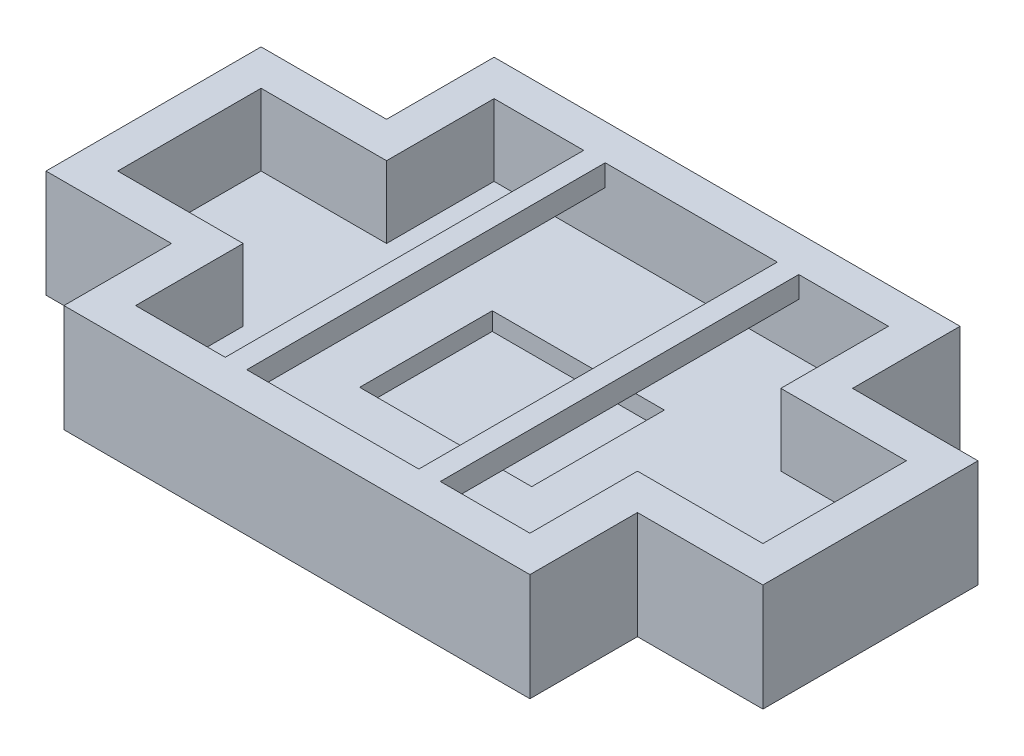
ISO-10303-21;
HEADER;
FILE_DESCRIPTION(('STEP AP214'),'2;1');
FILE_NAME('part.step','',(''),(''),'','','');
FILE_SCHEMA(('AUTOMOTIVE_DESIGN { 1 0 10303 214 1 1 1 1 }'));
ENDSEC;
DATA;
#1=APPLICATION_CONTEXT('core data for automotive mechanical design processes');
#2=APPLICATION_PROTOCOL_DEFINITION('international standard','automotive_design',2000,#1);
#3=PRODUCT_CONTEXT('',#1,'mechanical');
#4=PRODUCT('Part','Part','',(#3));
#5=PRODUCT_RELATED_PRODUCT_CATEGORY('part','',(#4));
#6=PRODUCT_DEFINITION_FORMATION('','',#4);
#7=PRODUCT_DEFINITION_CONTEXT('part definition',#1,'design');
#8=PRODUCT_DEFINITION('design','',#6,#7);
#9=PRODUCT_DEFINITION_SHAPE('','',#8);
#10=(LENGTH_UNIT() NAMED_UNIT(*) SI_UNIT(.MILLI.,.METRE.));
#11=(NAMED_UNIT(*) PLANE_ANGLE_UNIT() SI_UNIT($,.RADIAN.));
#12=(NAMED_UNIT(*) SI_UNIT($,.STERADIAN.) SOLID_ANGLE_UNIT());
#13=UNCERTAINTY_MEASURE_WITH_UNIT(LENGTH_MEASURE(1.E-05),#10,'distance_accuracy_value','');
#14=(GEOMETRIC_REPRESENTATION_CONTEXT(3) GLOBAL_UNCERTAINTY_ASSIGNED_CONTEXT((#13)) GLOBAL_UNIT_ASSIGNED_CONTEXT((#10,
#11,#12)) REPRESENTATION_CONTEXT('',''));
#15=CARTESIAN_POINT('',(0.,0.,0.));
#16=DIRECTION('',(0.,0.,1.));
#17=DIRECTION('',(1.,0.,0.));
#18=AXIS2_PLACEMENT_3D('',#15,#16,#17);
#19=CARTESIAN_POINT('',(325.,75.,0.));
#20=DIRECTION('',(1.,0.,0.));
#21=DIRECTION('',(0.,0.,-1.));
#22=AXIS2_PLACEMENT_3D('',#19,#20,#21);
#23=PLANE('',#22);
#24=DIRECTION('',(0.,0.,1.));
#25=VECTOR('',#24,1.);
#26=CARTESIAN_POINT('',(325.,-75.,0.));
#27=LINE('',#26,#25);
#28=CARTESIAN_POINT('',(325.,-75.,150.));
#29=VERTEX_POINT('',#28);
#30=CARTESIAN_POINT('',(325.,-75.,300.));
#31=VERTEX_POINT('',#30);
#32=EDGE_CURVE('E505',#29,#31,#27,.T.);
#33=ORIENTED_EDGE('',*,*,#32,.F.);
#34=DIRECTION('',(0.,-1.,0.));
#35=VECTOR('',#34,1.);
#36=CARTESIAN_POINT('',(325.,75.,150.));
#37=LINE('',#36,#35);
#38=CARTESIAN_POINT('',(325.,75.,150.));
#39=VERTEX_POINT('',#38);
#40=EDGE_CURVE('E51',#39,#29,#37,.T.);
#41=ORIENTED_EDGE('',*,*,#40,.F.);
#42=DIRECTION('',(0.,0.,1.));
#43=VECTOR('',#42,1.);
#44=CARTESIAN_POINT('',(325.,75.,0.));
#45=LINE('',#44,#43);
#46=CARTESIAN_POINT('',(325.,75.,300.));
#47=VERTEX_POINT('',#46);
#48=EDGE_CURVE('E517',#39,#47,#45,.T.);
#49=ORIENTED_EDGE('',*,*,#48,.T.);
#50=DIRECTION('',(0.,-1.,0.));
#51=VECTOR('',#50,1.);
#52=CARTESIAN_POINT('',(325.,75.,300.));
#53=LINE('',#52,#51);
#54=EDGE_CURVE('E560',#47,#31,#53,.T.);
#55=ORIENTED_EDGE('',*,*,#54,.T.);
#56=EDGE_LOOP('',(#33,#41,#49,#55));
#57=FACE_BOUND('',#56,.T.);
#58=ADVANCED_FACE('F43',(#57),#23,.T.);
#59=CARTESIAN_POINT('',(0.,75.,150.));
#60=DIRECTION('',(0.,0.,-1.));
#61=DIRECTION('',(-1.,0.,0.));
#62=AXIS2_PLACEMENT_3D('',#59,#60,#61);
#63=PLANE('',#62);
#64=DIRECTION('',(1.,0.,0.));
#65=VECTOR('',#64,1.);
#66=CARTESIAN_POINT('',(0.,-75.,150.));
#67=LINE('',#66,#65);
#68=CARTESIAN_POINT('',(500.,-75.,150.));
#69=VERTEX_POINT('',#68);
#70=EDGE_CURVE('E564',#29,#69,#67,.T.);
#71=ORIENTED_EDGE('',*,*,#70,.T.);
#72=DIRECTION('',(0.,-1.,0.));
#73=VECTOR('',#72,1.);
#74=CARTESIAN_POINT('',(500.,75.,150.));
#75=LINE('',#74,#73);
#76=CARTESIAN_POINT('',(500.,75.,150.));
#77=VERTEX_POINT('',#76);
#78=EDGE_CURVE('E636',#77,#69,#75,.T.);
#79=ORIENTED_EDGE('',*,*,#78,.F.);
#80=DIRECTION('',(1.,0.,0.));
#81=VECTOR('',#80,1.);
#82=CARTESIAN_POINT('',(0.,75.,150.));
#83=LINE('',#82,#81);
#84=EDGE_CURVE('E521',#39,#77,#83,.T.);
#85=ORIENTED_EDGE('',*,*,#84,.F.);
#86=ORIENTED_EDGE('',*,*,#40,.T.);
#87=EDGE_LOOP('',(#71,#79,#85,#86));
#88=FACE_BOUND('',#87,.T.);
#89=ADVANCED_FACE('F642',(#88),#63,.F.);
#90=CARTESIAN_POINT('',(500.,75.,0.));
#91=DIRECTION('',(1.,0.,0.));
#92=DIRECTION('',(0.,0.,-1.));
#93=AXIS2_PLACEMENT_3D('',#90,#91,#92);
#94=PLANE('',#93);
#95=DIRECTION('',(0.,0.,1.));
#96=VECTOR('',#95,1.);
#97=CARTESIAN_POINT('',(500.,-75.,0.));
#98=LINE('',#97,#96);
#99=CARTESIAN_POINT('',(500.,-75.,-150.));
#100=VERTEX_POINT('',#99);
#101=EDGE_CURVE('E568',#100,#69,#98,.T.);
#102=ORIENTED_EDGE('',*,*,#101,.F.);
#103=DIRECTION('',(0.,-1.,0.));
#104=VECTOR('',#103,1.);
#105=CARTESIAN_POINT('',(500.,75.,-150.));
#106=LINE('',#105,#104);
#107=CARTESIAN_POINT('',(500.,75.,-150.));
#108=VERTEX_POINT('',#107);
#109=EDGE_CURVE('E633',#108,#100,#106,.T.);
#110=ORIENTED_EDGE('',*,*,#109,.F.);
#111=DIRECTION('',(0.,0.,1.));
#112=VECTOR('',#111,1.);
#113=CARTESIAN_POINT('',(500.,75.,0.));
#114=LINE('',#113,#112);
#115=EDGE_CURVE('E525',#108,#77,#114,.T.);
#116=ORIENTED_EDGE('',*,*,#115,.T.);
#117=ORIENTED_EDGE('',*,*,#78,.T.);
#118=EDGE_LOOP('',(#102,#110,#116,#117));
#119=FACE_BOUND('',#118,.T.);
#120=ADVANCED_FACE('F693',(#119),#94,.T.);
#121=CARTESIAN_POINT('',(0.,75.,-150.));
#122=DIRECTION('',(0.,0.,-1.));
#123=DIRECTION('',(-1.,0.,0.));
#124=AXIS2_PLACEMENT_3D('',#121,#122,#123);
#125=PLANE('',#124);
#126=DIRECTION('',(1.,0.,0.));
#127=VECTOR('',#126,1.);
#128=CARTESIAN_POINT('',(0.,-75.,-150.));
#129=LINE('',#128,#127);
#130=CARTESIAN_POINT('',(325.,-75.,-150.));
#131=VERTEX_POINT('',#130);
#132=EDGE_CURVE('E572',#131,#100,#129,.T.);
#133=ORIENTED_EDGE('',*,*,#132,.F.);
#134=DIRECTION('',(0.,-1.,0.));
#135=VECTOR('',#134,1.);
#136=CARTESIAN_POINT('',(325.,75.,-150.));
#137=LINE('',#136,#135);
#138=CARTESIAN_POINT('',(325.,75.,-150.));
#139=VERTEX_POINT('',#138);
#140=EDGE_CURVE('E630',#139,#131,#137,.T.);
#141=ORIENTED_EDGE('',*,*,#140,.F.);
#142=DIRECTION('',(1.,0.,0.));
#143=VECTOR('',#142,1.);
#144=CARTESIAN_POINT('',(0.,75.,-150.));
#145=LINE('',#144,#143);
#146=EDGE_CURVE('E529',#139,#108,#145,.T.);
#147=ORIENTED_EDGE('',*,*,#146,.T.);
#148=ORIENTED_EDGE('',*,*,#109,.T.);
#149=EDGE_LOOP('',(#133,#141,#147,#148));
#150=FACE_BOUND('',#149,.T.);
#151=ADVANCED_FACE('F689',(#150),#125,.T.);
#152=CARTESIAN_POINT('',(325.,75.,0.));
#153=DIRECTION('',(1.,0.,0.));
#154=DIRECTION('',(0.,0.,-1.));
#155=AXIS2_PLACEMENT_3D('',#152,#153,#154);
#156=PLANE('',#155);
#157=DIRECTION('',(0.,0.,1.));
#158=VECTOR('',#157,1.);
#159=CARTESIAN_POINT('',(325.,-75.,0.));
#160=LINE('',#159,#158);
#161=CARTESIAN_POINT('',(325.,-75.,-300.));
#162=VERTEX_POINT('',#161);
#163=EDGE_CURVE('E576',#162,#131,#160,.T.);
#164=ORIENTED_EDGE('',*,*,#163,.F.);
#165=DIRECTION('',(0.,-1.,0.));
#166=VECTOR('',#165,1.);
#167=CARTESIAN_POINT('',(325.,75.,-300.));
#168=LINE('',#167,#166);
#169=CARTESIAN_POINT('',(325.,75.,-300.));
#170=VERTEX_POINT('',#169);
#171=EDGE_CURVE('E627',#170,#162,#168,.T.);
#172=ORIENTED_EDGE('',*,*,#171,.F.);
#173=DIRECTION('',(0.,0.,1.));
#174=VECTOR('',#173,1.);
#175=CARTESIAN_POINT('',(325.,75.,0.));
#176=LINE('',#175,#174);
#177=EDGE_CURVE('E533',#170,#139,#176,.T.);
#178=ORIENTED_EDGE('',*,*,#177,.T.);
#179=ORIENTED_EDGE('',*,*,#140,.T.);
#180=EDGE_LOOP('',(#164,#172,#178,#179));
#181=FACE_BOUND('',#180,.T.);
#182=ADVANCED_FACE('F686',(#181),#156,.T.);
#183=CARTESIAN_POINT('',(0.,75.,-300.));
#184=DIRECTION('',(0.,0.,-1.));
#185=DIRECTION('',(-1.,0.,0.));
#186=AXIS2_PLACEMENT_3D('',#183,#184,#185);
#187=PLANE('',#186);
#188=DIRECTION('',(1.,0.,0.));
#189=VECTOR('',#188,1.);
#190=CARTESIAN_POINT('',(0.,-75.,-300.));
#191=LINE('',#190,#189);
#192=CARTESIAN_POINT('',(-325.,-75.,-300.));
#193=VERTEX_POINT('',#192);
#194=EDGE_CURVE('E580',#193,#162,#191,.T.);
#195=ORIENTED_EDGE('',*,*,#194,.F.);
#196=DIRECTION('',(0.,-1.,0.));
#197=VECTOR('',#196,1.);
#198=CARTESIAN_POINT('',(-325.,75.,-300.));
#199=LINE('',#198,#197);
#200=CARTESIAN_POINT('',(-325.,75.,-300.));
#201=VERTEX_POINT('',#200);
#202=EDGE_CURVE('E624',#201,#193,#199,.T.);
#203=ORIENTED_EDGE('',*,*,#202,.F.);
#204=DIRECTION('',(1.,0.,0.));
#205=VECTOR('',#204,1.);
#206=CARTESIAN_POINT('',(0.,75.,-300.));
#207=LINE('',#206,#205);
#208=EDGE_CURVE('E537',#201,#170,#207,.T.);
#209=ORIENTED_EDGE('',*,*,#208,.T.);
#210=ORIENTED_EDGE('',*,*,#171,.T.);
#211=EDGE_LOOP('',(#195,#203,#209,#210));
#212=FACE_BOUND('',#211,.T.);
#213=ADVANCED_FACE('F681',(#212),#187,.T.);
#214=CARTESIAN_POINT('',(-325.,75.,0.));
#215=DIRECTION('',(1.,0.,0.));
#216=DIRECTION('',(0.,0.,-1.));
#217=AXIS2_PLACEMENT_3D('',#214,#215,#216);
#218=PLANE('',#217);
#219=DIRECTION('',(0.,0.,1.));
#220=VECTOR('',#219,1.);
#221=CARTESIAN_POINT('',(-325.,-75.,0.));
#222=LINE('',#221,#220);
#223=CARTESIAN_POINT('',(-325.,-75.,-150.));
#224=VERTEX_POINT('',#223);
#225=EDGE_CURVE('E584',#193,#224,#222,.T.);
#226=ORIENTED_EDGE('',*,*,#225,.T.);
#227=DIRECTION('',(0.,-1.,0.));
#228=VECTOR('',#227,1.);
#229=CARTESIAN_POINT('',(-325.,75.,-150.));
#230=LINE('',#229,#228);
#231=CARTESIAN_POINT('',(-325.,75.,-150.));
#232=VERTEX_POINT('',#231);
#233=EDGE_CURVE('E621',#232,#224,#230,.T.);
#234=ORIENTED_EDGE('',*,*,#233,.F.);
#235=DIRECTION('',(0.,0.,1.));
#236=VECTOR('',#235,1.);
#237=CARTESIAN_POINT('',(-325.,75.,0.));
#238=LINE('',#237,#236);
#239=EDGE_CURVE('E541',#201,#232,#238,.T.);
#240=ORIENTED_EDGE('',*,*,#239,.F.);
#241=ORIENTED_EDGE('',*,*,#202,.T.);
#242=EDGE_LOOP('',(#226,#234,#240,#241));
#243=FACE_BOUND('',#242,.T.);
#244=ADVANCED_FACE('F678',(#243),#218,.F.);
#245=CARTESIAN_POINT('',(0.,75.,-150.));
#246=DIRECTION('',(0.,0.,-1.));
#247=DIRECTION('',(-1.,0.,0.));
#248=AXIS2_PLACEMENT_3D('',#245,#246,#247);
#249=PLANE('',#248);
#250=DIRECTION('',(1.,0.,0.));
#251=VECTOR('',#250,1.);
#252=CARTESIAN_POINT('',(0.,-75.,-150.));
#253=LINE('',#252,#251);
#254=CARTESIAN_POINT('',(-500.,-75.,-150.));
#255=VERTEX_POINT('',#254);
#256=EDGE_CURVE('E588',#255,#224,#253,.T.);
#257=ORIENTED_EDGE('',*,*,#256,.F.);
#258=DIRECTION('',(0.,-1.,0.));
#259=VECTOR('',#258,1.);
#260=CARTESIAN_POINT('',(-500.,75.,-150.));
#261=LINE('',#260,#259);
#262=CARTESIAN_POINT('',(-500.,75.,-150.));
#263=VERTEX_POINT('',#262);
#264=EDGE_CURVE('E618',#263,#255,#261,.T.);
#265=ORIENTED_EDGE('',*,*,#264,.F.);
#266=DIRECTION('',(1.,0.,0.));
#267=VECTOR('',#266,1.);
#268=CARTESIAN_POINT('',(0.,75.,-150.));
#269=LINE('',#268,#267);
#270=EDGE_CURVE('E544',#263,#232,#269,.T.);
#271=ORIENTED_EDGE('',*,*,#270,.T.);
#272=ORIENTED_EDGE('',*,*,#233,.T.);
#273=EDGE_LOOP('',(#257,#265,#271,#272));
#274=FACE_BOUND('',#273,.T.);
#275=ADVANCED_FACE('F674',(#274),#249,.T.);
#276=CARTESIAN_POINT('',(-500.,75.,0.));
#277=DIRECTION('',(1.,0.,0.));
#278=DIRECTION('',(0.,0.,-1.));
#279=AXIS2_PLACEMENT_3D('',#276,#277,#278);
#280=PLANE('',#279);
#281=DIRECTION('',(0.,0.,1.));
#282=VECTOR('',#281,1.);
#283=CARTESIAN_POINT('',(-500.,-75.,0.));
#284=LINE('',#283,#282);
#285=CARTESIAN_POINT('',(-500.,-75.,150.));
#286=VERTEX_POINT('',#285);
#287=EDGE_CURVE('E592',#255,#286,#284,.T.);
#288=ORIENTED_EDGE('',*,*,#287,.T.);
#289=DIRECTION('',(0.,-1.,0.));
#290=VECTOR('',#289,1.);
#291=CARTESIAN_POINT('',(-500.,75.,150.));
#292=LINE('',#291,#290);
#293=CARTESIAN_POINT('',(-500.,75.,150.));
#294=VERTEX_POINT('',#293);
#295=EDGE_CURVE('E614',#294,#286,#292,.T.);
#296=ORIENTED_EDGE('',*,*,#295,.F.);
#297=DIRECTION('',(0.,0.,1.));
#298=VECTOR('',#297,1.);
#299=CARTESIAN_POINT('',(-500.,75.,0.));
#300=LINE('',#299,#298);
#301=EDGE_CURVE('E548',#263,#294,#300,.T.);
#302=ORIENTED_EDGE('',*,*,#301,.F.);
#303=ORIENTED_EDGE('',*,*,#264,.T.);
#304=EDGE_LOOP('',(#288,#296,#302,#303));
#305=FACE_BOUND('',#304,.T.);
#306=ADVANCED_FACE('F669',(#305),#280,.F.);
#307=CARTESIAN_POINT('',(0.,75.,150.));
#308=DIRECTION('',(0.,0.,-1.));
#309=DIRECTION('',(-1.,0.,0.));
#310=AXIS2_PLACEMENT_3D('',#307,#308,#309);
#311=PLANE('',#310);
#312=DIRECTION('',(1.,0.,0.));
#313=VECTOR('',#312,1.);
#314=CARTESIAN_POINT('',(0.,-75.,150.));
#315=LINE('',#314,#313);
#316=CARTESIAN_POINT('',(-325.,-75.,150.));
#317=VERTEX_POINT('',#316);
#318=EDGE_CURVE('E595',#286,#317,#315,.T.);
#319=ORIENTED_EDGE('',*,*,#318,.T.);
#320=DIRECTION('',(0.,-1.,0.));
#321=VECTOR('',#320,1.);
#322=CARTESIAN_POINT('',(-325.,75.,150.));
#323=LINE('',#322,#321);
#324=CARTESIAN_POINT('',(-325.,75.,150.));
#325=VERTEX_POINT('',#324);
#326=EDGE_CURVE('E610',#325,#317,#323,.T.);
#327=ORIENTED_EDGE('',*,*,#326,.F.);
#328=DIRECTION('',(1.,0.,0.));
#329=VECTOR('',#328,1.);
#330=CARTESIAN_POINT('',(0.,75.,150.));
#331=LINE('',#330,#329);
#332=EDGE_CURVE('E551',#294,#325,#331,.T.);
#333=ORIENTED_EDGE('',*,*,#332,.F.);
#334=ORIENTED_EDGE('',*,*,#295,.T.);
#335=EDGE_LOOP('',(#319,#327,#333,#334));
#336=FACE_BOUND('',#335,.T.);
#337=ADVANCED_FACE('F665',(#336),#311,.F.);
#338=CARTESIAN_POINT('',(-325.,75.,0.));
#339=DIRECTION('',(1.,0.,0.));
#340=DIRECTION('',(0.,0.,-1.));
#341=AXIS2_PLACEMENT_3D('',#338,#339,#340);
#342=PLANE('',#341);
#343=DIRECTION('',(0.,0.,1.));
#344=VECTOR('',#343,1.);
#345=CARTESIAN_POINT('',(-325.,-75.,0.));
#346=LINE('',#345,#344);
#347=CARTESIAN_POINT('',(-325.,-75.,300.));
#348=VERTEX_POINT('',#347);
#349=EDGE_CURVE('E598',#317,#348,#346,.T.);
#350=ORIENTED_EDGE('',*,*,#349,.T.);
#351=DIRECTION('',(0.,-1.,0.));
#352=VECTOR('',#351,1.);
#353=CARTESIAN_POINT('',(-325.,75.,300.));
#354=LINE('',#353,#352);
#355=CARTESIAN_POINT('',(-325.,75.,300.));
#356=VERTEX_POINT('',#355);
#357=EDGE_CURVE('E606',#356,#348,#354,.T.);
#358=ORIENTED_EDGE('',*,*,#357,.F.);
#359=DIRECTION('',(0.,0.,1.));
#360=VECTOR('',#359,1.);
#361=CARTESIAN_POINT('',(-325.,75.,0.));
#362=LINE('',#361,#360);
#363=EDGE_CURVE('E554',#325,#356,#362,.T.);
#364=ORIENTED_EDGE('',*,*,#363,.F.);
#365=ORIENTED_EDGE('',*,*,#326,.T.);
#366=EDGE_LOOP('',(#350,#358,#364,#365));
#367=FACE_BOUND('',#366,.T.);
#368=ADVANCED_FACE('F660',(#367),#342,.F.);
#369=CARTESIAN_POINT('',(0.,75.,300.));
#370=DIRECTION('',(0.,0.,-1.));
#371=DIRECTION('',(-1.,0.,0.));
#372=AXIS2_PLACEMENT_3D('',#369,#370,#371);
#373=PLANE('',#372);
#374=DIRECTION('',(1.,0.,0.));
#375=VECTOR('',#374,1.);
#376=CARTESIAN_POINT('',(0.,-75.,300.));
#377=LINE('',#376,#375);
#378=EDGE_CURVE('E522',#348,#31,#377,.T.);
#379=ORIENTED_EDGE('',*,*,#378,.T.);
#380=ORIENTED_EDGE('',*,*,#54,.F.);
#381=DIRECTION('',(1.,0.,0.));
#382=VECTOR('',#381,1.);
#383=CARTESIAN_POINT('',(0.,75.,300.));
#384=LINE('',#383,#382);
#385=EDGE_CURVE('E557',#356,#47,#384,.T.);
#386=ORIENTED_EDGE('',*,*,#385,.F.);
#387=ORIENTED_EDGE('',*,*,#357,.T.);
#388=EDGE_LOOP('',(#379,#380,#386,#387));
#389=FACE_BOUND('',#388,.T.);
#390=ADVANCED_FACE('F654',(#389),#373,.F.);
#391=CARTESIAN_POINT('',(0.,75.,0.));
#392=DIRECTION('',(0.,1.,0.));
#393=DIRECTION('',(0.,0.,1.));
#394=AXIS2_PLACEMENT_3D('',#391,#392,#393);
#395=PLANE('',#394);
#396=DIRECTION('',(1.,0.,0.));
#397=VECTOR('',#396,1.);
#398=CARTESIAN_POINT('',(-275.,75.,-250.));
#399=LINE('',#398,#397);
#400=CARTESIAN_POINT('',(-120.,75.,-250.));
#401=VERTEX_POINT('',#400);
#402=CARTESIAN_POINT('',(120.,75.,-250.));
#403=VERTEX_POINT('',#402);
#404=EDGE_CURVE('E428',#401,#403,#399,.T.);
#405=ORIENTED_EDGE('',*,*,#404,.T.);
#406=DIRECTION('',(0.,0.,1.));
#407=VECTOR('',#406,1.);
#408=CARTESIAN_POINT('',(120.,75.,-250.));
#409=LINE('',#408,#407);
#410=CARTESIAN_POINT('',(120.,75.,250.));
#411=VERTEX_POINT('',#410);
#412=EDGE_CURVE('E294',#403,#411,#409,.T.);
#413=ORIENTED_EDGE('',*,*,#412,.T.);
#414=DIRECTION('',(1.,0.,0.));
#415=VECTOR('',#414,1.);
#416=CARTESIAN_POINT('',(-275.,75.,250.));
#417=LINE('',#416,#415);
#418=CARTESIAN_POINT('',(-120.,75.,250.));
#419=VERTEX_POINT('',#418);
#420=EDGE_CURVE('E403',#419,#411,#417,.T.);
#421=ORIENTED_EDGE('',*,*,#420,.F.);
#422=DIRECTION('',(0.,0.,-1.));
#423=VECTOR('',#422,1.);
#424=CARTESIAN_POINT('',(-120.,75.,-250.));
#425=LINE('',#424,#423);
#426=EDGE_CURVE('E314',#419,#401,#425,.T.);
#427=ORIENTED_EDGE('',*,*,#426,.T.);
#428=EDGE_LOOP('',(#405,#413,#421,#427));
#429=FACE_BOUND('',#428,.T.);
#430=CARTESIAN_POINT('',(-275.,75.,-250.));
#431=VERTEX_POINT('',#430);
#432=CARTESIAN_POINT('',(-150.,75.,-250.));
#433=VERTEX_POINT('',#432);
#434=EDGE_CURVE('E423',#431,#433,#399,.T.);
#435=ORIENTED_EDGE('',*,*,#434,.T.);
#436=DIRECTION('',(0.,0.,1.));
#437=VECTOR('',#436,1.);
#438=CARTESIAN_POINT('',(-150.,75.,-250.));
#439=LINE('',#438,#437);
#440=CARTESIAN_POINT('',(-150.,75.,250.));
#441=VERTEX_POINT('',#440);
#442=EDGE_CURVE('E325',#433,#441,#439,.T.);
#443=ORIENTED_EDGE('',*,*,#442,.T.);
#444=CARTESIAN_POINT('',(-275.,75.,250.));
#445=VERTEX_POINT('',#444);
#446=EDGE_CURVE('E399',#445,#441,#417,.T.);
#447=ORIENTED_EDGE('',*,*,#446,.F.);
#448=DIRECTION('',(0.,0.,1.));
#449=VECTOR('',#448,1.);
#450=CARTESIAN_POINT('',(-275.,75.,100.));
#451=LINE('',#450,#449);
#452=CARTESIAN_POINT('',(-275.,75.,100.));
#453=VERTEX_POINT('',#452);
#454=EDGE_CURVE('E394',#453,#445,#451,.T.);
#455=ORIENTED_EDGE('',*,*,#454,.F.);
#456=DIRECTION('',(1.,0.,0.));
#457=VECTOR('',#456,1.);
#458=CARTESIAN_POINT('',(-450.,75.,100.));
#459=LINE('',#458,#457);
#460=CARTESIAN_POINT('',(-450.,75.,100.));
#461=VERTEX_POINT('',#460);
#462=EDGE_CURVE('E390',#461,#453,#459,.T.);
#463=ORIENTED_EDGE('',*,*,#462,.F.);
#464=DIRECTION('',(0.,0.,1.));
#465=VECTOR('',#464,1.);
#466=CARTESIAN_POINT('',(-450.,75.,-100.));
#467=LINE('',#466,#465);
#468=CARTESIAN_POINT('',(-450.,75.,-100.));
#469=VERTEX_POINT('',#468);
#470=EDGE_CURVE('E335',#469,#461,#467,.T.);
#471=ORIENTED_EDGE('',*,*,#470,.F.);
#472=DIRECTION('',(1.,0.,0.));
#473=VECTOR('',#472,1.);
#474=CARTESIAN_POINT('',(-450.,75.,-100.));
#475=LINE('',#474,#473);
#476=CARTESIAN_POINT('',(-275.,75.,-100.));
#477=VERTEX_POINT('',#476);
#478=EDGE_CURVE('E432',#469,#477,#475,.T.);
#479=ORIENTED_EDGE('',*,*,#478,.T.);
#480=DIRECTION('',(0.,0.,1.));
#481=VECTOR('',#480,1.);
#482=CARTESIAN_POINT('',(-275.,75.,-250.));
#483=LINE('',#482,#481);
#484=EDGE_CURVE('E427',#431,#477,#483,.T.);
#485=ORIENTED_EDGE('',*,*,#484,.F.);
#486=EDGE_LOOP('',(#435,#443,#447,#455,#463,#471,#479,#485));
#487=FACE_BOUND('',#486,.T.);
#488=DIRECTION('',(0.,0.,-1.));
#489=VECTOR('',#488,1.);
#490=CARTESIAN_POINT('',(150.,75.,-250.));
#491=LINE('',#490,#489);
#492=CARTESIAN_POINT('',(150.,75.,250.));
#493=VERTEX_POINT('',#492);
#494=CARTESIAN_POINT('',(150.,75.,-250.));
#495=VERTEX_POINT('',#494);
#496=EDGE_CURVE('E58',#493,#495,#491,.T.);
#497=ORIENTED_EDGE('',*,*,#496,.T.);
#498=CARTESIAN_POINT('',(275.,75.,-250.));
#499=VERTEX_POINT('',#498);
#500=EDGE_CURVE('E298',#495,#499,#399,.T.);
#501=ORIENTED_EDGE('',*,*,#500,.T.);
#502=DIRECTION('',(0.,0.,1.));
#503=VECTOR('',#502,1.);
#504=CARTESIAN_POINT('',(275.,75.,-250.));
#505=LINE('',#504,#503);
#506=CARTESIAN_POINT('',(275.,75.,-100.));
#507=VERTEX_POINT('',#506);
#508=EDGE_CURVE('E419',#499,#507,#505,.T.);
#509=ORIENTED_EDGE('',*,*,#508,.T.);
#510=DIRECTION('',(1.,0.,0.));
#511=VECTOR('',#510,1.);
#512=CARTESIAN_POINT('',(275.,75.,-100.));
#513=LINE('',#512,#511);
#514=CARTESIAN_POINT('',(450.,75.,-100.));
#515=VERTEX_POINT('',#514);
#516=EDGE_CURVE('E415',#507,#515,#513,.T.);
#517=ORIENTED_EDGE('',*,*,#516,.T.);
#518=DIRECTION('',(0.,0.,1.));
#519=VECTOR('',#518,1.);
#520=CARTESIAN_POINT('',(450.,75.,-100.));
#521=LINE('',#520,#519);
#522=CARTESIAN_POINT('',(450.,75.,100.));
#523=VERTEX_POINT('',#522);
#524=EDGE_CURVE('E411',#515,#523,#521,.T.);
#525=ORIENTED_EDGE('',*,*,#524,.T.);
#526=DIRECTION('',(1.,0.,0.));
#527=VECTOR('',#526,1.);
#528=CARTESIAN_POINT('',(275.,75.,100.));
#529=LINE('',#528,#527);
#530=CARTESIAN_POINT('',(275.,75.,100.));
#531=VERTEX_POINT('',#530);
#532=EDGE_CURVE('E407',#531,#523,#529,.T.);
#533=ORIENTED_EDGE('',*,*,#532,.F.);
#534=DIRECTION('',(0.,0.,1.));
#535=VECTOR('',#534,1.);
#536=CARTESIAN_POINT('',(275.,75.,100.));
#537=LINE('',#536,#535);
#538=CARTESIAN_POINT('',(275.,75.,250.));
#539=VERTEX_POINT('',#538);
#540=EDGE_CURVE('E402',#531,#539,#537,.T.);
#541=ORIENTED_EDGE('',*,*,#540,.T.);
#542=EDGE_CURVE('E398',#493,#539,#417,.T.);
#543=ORIENTED_EDGE('',*,*,#542,.F.);
#544=EDGE_LOOP('',(#497,#501,#509,#517,#525,#533,#541,#543));
#545=FACE_BOUND('',#544,.T.);
#546=ORIENTED_EDGE('',*,*,#48,.F.);
#547=ORIENTED_EDGE('',*,*,#84,.T.);
#548=ORIENTED_EDGE('',*,*,#115,.F.);
#549=ORIENTED_EDGE('',*,*,#146,.F.);
#550=ORIENTED_EDGE('',*,*,#177,.F.);
#551=ORIENTED_EDGE('',*,*,#208,.F.);
#552=ORIENTED_EDGE('',*,*,#239,.T.);
#553=ORIENTED_EDGE('',*,*,#270,.F.);
#554=ORIENTED_EDGE('',*,*,#301,.T.);
#555=ORIENTED_EDGE('',*,*,#332,.T.);
#556=ORIENTED_EDGE('',*,*,#363,.T.);
#557=ORIENTED_EDGE('',*,*,#385,.T.);
#558=EDGE_LOOP('',(#546,#547,#548,#549,#550,#551,#552,#553,#554,#555,#556,#557));
#559=FACE_BOUND('',#558,.T.);
#560=ADVANCED_FACE('F695',(#429,#487,#545,#559),#395,.T.);
#561=CARTESIAN_POINT('',(0.,-75.,0.));
#562=DIRECTION('',(0.,1.,0.));
#563=DIRECTION('',(0.,0.,1.));
#564=AXIS2_PLACEMENT_3D('',#561,#562,#563);
#565=PLANE('',#564);
#566=ORIENTED_EDGE('',*,*,#32,.T.);
#567=ORIENTED_EDGE('',*,*,#378,.F.);
#568=ORIENTED_EDGE('',*,*,#349,.F.);
#569=ORIENTED_EDGE('',*,*,#318,.F.);
#570=ORIENTED_EDGE('',*,*,#287,.F.);
#571=ORIENTED_EDGE('',*,*,#256,.T.);
#572=ORIENTED_EDGE('',*,*,#225,.F.);
#573=ORIENTED_EDGE('',*,*,#194,.T.);
#574=ORIENTED_EDGE('',*,*,#163,.T.);
#575=ORIENTED_EDGE('',*,*,#132,.T.);
#576=ORIENTED_EDGE('',*,*,#101,.T.);
#577=ORIENTED_EDGE('',*,*,#70,.F.);
#578=EDGE_LOOP('',(#566,#567,#568,#569,#570,#571,#572,#573,#574,#575,#576,#577));
#579=FACE_BOUND('',#578,.T.);
#580=ADVANCED_FACE('F648',(#579),#565,.F.);
#581=CARTESIAN_POINT('',(0.,-25.,0.));
#582=DIRECTION('',(0.,1.,0.));
#583=DIRECTION('',(0.,0.,1.));
#584=AXIS2_PLACEMENT_3D('',#581,#582,#583);
#585=PLANE('',#584);
#586=DIRECTION('',(0.,0.,-1.));
#587=VECTOR('',#586,1.);
#588=CARTESIAN_POINT('',(-450.,-24.9999999999999,-100.));
#589=LINE('',#588,#587);
#590=CARTESIAN_POINT('',(-450.,-24.9999999999999,100.));
#591=VERTEX_POINT('',#590);
#592=CARTESIAN_POINT('',(-450.,-24.9999999999999,-100.));
#593=VERTEX_POINT('',#592);
#594=EDGE_CURVE('E384',#591,#593,#589,.T.);
#595=ORIENTED_EDGE('',*,*,#594,.F.);
#596=DIRECTION('',(-1.,0.,0.));
#597=VECTOR('',#596,1.);
#598=CARTESIAN_POINT('',(-450.,-24.9999999999999,100.));
#599=LINE('',#598,#597);
#600=CARTESIAN_POINT('',(-275.,-24.9999999999999,100.));
#601=VERTEX_POINT('',#600);
#602=EDGE_CURVE('E387',#601,#591,#599,.T.);
#603=ORIENTED_EDGE('',*,*,#602,.F.);
#604=DIRECTION('',(0.,0.,-1.));
#605=VECTOR('',#604,1.);
#606=CARTESIAN_POINT('',(-275.,-24.9999999999999,100.));
#607=LINE('',#606,#605);
#608=CARTESIAN_POINT('',(-275.,-24.9999999999999,250.));
#609=VERTEX_POINT('',#608);
#610=EDGE_CURVE('E347',#609,#601,#607,.T.);
#611=ORIENTED_EDGE('',*,*,#610,.F.);
#612=DIRECTION('',(-1.,0.,0.));
#613=VECTOR('',#612,1.);
#614=CARTESIAN_POINT('',(-275.,-24.9999999999999,250.));
#615=LINE('',#614,#613);
#616=CARTESIAN_POINT('',(275.,-24.9999999999999,250.));
#617=VERTEX_POINT('',#616);
#618=EDGE_CURVE('E350',#617,#609,#615,.T.);
#619=ORIENTED_EDGE('',*,*,#618,.F.);
#620=DIRECTION('',(0.,0.,-1.));
#621=VECTOR('',#620,1.);
#622=CARTESIAN_POINT('',(275.,-24.9999999999999,100.));
#623=LINE('',#622,#621);
#624=CARTESIAN_POINT('',(275.,-24.9999999999999,100.));
#625=VERTEX_POINT('',#624);
#626=EDGE_CURVE('E354',#617,#625,#623,.T.);
#627=ORIENTED_EDGE('',*,*,#626,.T.);
#628=DIRECTION('',(-1.,0.,0.));
#629=VECTOR('',#628,1.);
#630=CARTESIAN_POINT('',(275.,-24.9999999999999,100.));
#631=LINE('',#630,#629);
#632=CARTESIAN_POINT('',(450.,-24.9999999999999,100.));
#633=VERTEX_POINT('',#632);
#634=EDGE_CURVE('E358',#633,#625,#631,.T.);
#635=ORIENTED_EDGE('',*,*,#634,.F.);
#636=DIRECTION('',(0.,0.,-1.));
#637=VECTOR('',#636,1.);
#638=CARTESIAN_POINT('',(450.,-24.9999999999999,-100.));
#639=LINE('',#638,#637);
#640=CARTESIAN_POINT('',(450.,-24.9999999999999,-100.));
#641=VERTEX_POINT('',#640);
#642=EDGE_CURVE('E361',#633,#641,#639,.T.);
#643=ORIENTED_EDGE('',*,*,#642,.T.);
#644=DIRECTION('',(-1.,0.,0.));
#645=VECTOR('',#644,1.);
#646=CARTESIAN_POINT('',(275.,-24.9999999999999,-100.));
#647=LINE('',#646,#645);
#648=CARTESIAN_POINT('',(275.,-24.9999999999999,-100.));
#649=VERTEX_POINT('',#648);
#650=EDGE_CURVE('E365',#641,#649,#647,.T.);
#651=ORIENTED_EDGE('',*,*,#650,.T.);
#652=DIRECTION('',(0.,0.,-1.));
#653=VECTOR('',#652,1.);
#654=CARTESIAN_POINT('',(275.,-24.9999999999999,-250.));
#655=LINE('',#654,#653);
#656=CARTESIAN_POINT('',(275.,-24.9999999999999,-250.));
#657=VERTEX_POINT('',#656);
#658=EDGE_CURVE('E369',#649,#657,#655,.T.);
#659=ORIENTED_EDGE('',*,*,#658,.T.);
#660=DIRECTION('',(-1.,0.,0.));
#661=VECTOR('',#660,1.);
#662=CARTESIAN_POINT('',(-275.,-24.9999999999999,-250.));
#663=LINE('',#662,#661);
#664=CARTESIAN_POINT('',(-275.,-24.9999999999999,-250.));
#665=VERTEX_POINT('',#664);
#666=EDGE_CURVE('E373',#657,#665,#663,.T.);
#667=ORIENTED_EDGE('',*,*,#666,.T.);
#668=DIRECTION('',(0.,0.,-1.));
#669=VECTOR('',#668,1.);
#670=CARTESIAN_POINT('',(-275.,-24.9999999999999,-250.));
#671=LINE('',#670,#669);
#672=CARTESIAN_POINT('',(-275.,-24.9999999999999,-100.));
#673=VERTEX_POINT('',#672);
#674=EDGE_CURVE('E377',#673,#665,#671,.T.);
#675=ORIENTED_EDGE('',*,*,#674,.F.);
#676=DIRECTION('',(-1.,0.,0.));
#677=VECTOR('',#676,1.);
#678=CARTESIAN_POINT('',(-450.,-24.9999999999999,-100.));
#679=LINE('',#678,#677);
#680=EDGE_CURVE('E380',#673,#593,#679,.T.);
#681=ORIENTED_EDGE('',*,*,#680,.T.);
#682=EDGE_LOOP('',(#595,#603,#611,#619,#627,#635,#643,#651,#659,#667,#675,#681));
#683=FACE_BOUND('',#682,.T.);
#684=DIRECTION('',(0.,0.,1.));
#685=VECTOR('',#684,1.);
#686=CARTESIAN_POINT('',(120.,-25.,92.5));
#687=LINE('',#686,#685);
#688=CARTESIAN_POINT('',(120.,-25.,-92.5));
#689=VERTEX_POINT('',#688);
#690=CARTESIAN_POINT('',(120.,-25.,92.5));
#691=VERTEX_POINT('',#690);
#692=EDGE_CURVE('E481',#689,#691,#687,.T.);
#693=ORIENTED_EDGE('',*,*,#692,.T.);
#694=DIRECTION('',(-1.,0.,0.));
#695=VECTOR('',#694,1.);
#696=CARTESIAN_POINT('',(120.,-25.,92.5));
#697=LINE('',#696,#695);
#698=CARTESIAN_POINT('',(-120.,-25.,92.5));
#699=VERTEX_POINT('',#698);
#700=EDGE_CURVE('E478',#691,#699,#697,.T.);
#701=ORIENTED_EDGE('',*,*,#700,.T.);
#702=DIRECTION('',(0.,0.,-1.));
#703=VECTOR('',#702,1.);
#704=CARTESIAN_POINT('',(-120.,-25.,92.5));
#705=LINE('',#704,#703);
#706=CARTESIAN_POINT('',(-120.,-25.,-92.5));
#707=VERTEX_POINT('',#706);
#708=EDGE_CURVE('E475',#699,#707,#705,.T.);
#709=ORIENTED_EDGE('',*,*,#708,.T.);
#710=DIRECTION('',(1.,0.,0.));
#711=VECTOR('',#710,1.);
#712=CARTESIAN_POINT('',(120.,-25.,-92.5));
#713=LINE('',#712,#711);
#714=EDGE_CURVE('E12',#707,#689,#713,.T.);
#715=ORIENTED_EDGE('',*,*,#714,.T.);
#716=EDGE_LOOP('',(#693,#701,#709,#715));
#717=FACE_BOUND('',#716,.T.);
#718=ADVANCED_FACE('F704',(#683,#717),#585,.T.);
#719=CARTESIAN_POINT('',(-450.,-1104.5630140987,-100.));
#720=DIRECTION('',(-1.,0.,0.));
#721=DIRECTION('',(0.,0.,1.));
#722=AXIS2_PLACEMENT_3D('',#719,#720,#721);
#723=PLANE('',#722);
#724=ORIENTED_EDGE('',*,*,#594,.T.);
#725=DIRECTION('',(0.,1.,0.));
#726=VECTOR('',#725,1.);
#727=CARTESIAN_POINT('',(-450.,-1104.5630140987,-100.));
#728=LINE('',#727,#726);
#729=EDGE_CURVE('E351',#593,#469,#728,.T.);
#730=ORIENTED_EDGE('',*,*,#729,.T.);
#731=ORIENTED_EDGE('',*,*,#470,.T.);
#732=DIRECTION('',(0.,1.,0.));
#733=VECTOR('',#732,1.);
#734=CARTESIAN_POINT('',(-450.,-1104.5630140987,100.));
#735=LINE('',#734,#733);
#736=EDGE_CURVE('E436',#591,#461,#735,.T.);
#737=ORIENTED_EDGE('',*,*,#736,.F.);
#738=EDGE_LOOP('',(#724,#730,#731,#737));
#739=FACE_BOUND('',#738,.T.);
#740=ADVANCED_FACE('F754',(#739),#723,.F.);
#741=CARTESIAN_POINT('',(-450.,-1104.5630140987,-100.));
#742=DIRECTION('',(0.,0.,1.));
#743=DIRECTION('',(1.,0.,0.));
#744=AXIS2_PLACEMENT_3D('',#741,#742,#743);
#745=PLANE('',#744);
#746=DIRECTION('',(0.,1.,0.));
#747=VECTOR('',#746,1.);
#748=CARTESIAN_POINT('',(-275.,-1104.5630140987,-100.));
#749=LINE('',#748,#747);
#750=EDGE_CURVE('E439',#673,#477,#749,.T.);
#751=ORIENTED_EDGE('',*,*,#750,.T.);
#752=ORIENTED_EDGE('',*,*,#478,.F.);
#753=ORIENTED_EDGE('',*,*,#729,.F.);
#754=ORIENTED_EDGE('',*,*,#680,.F.);
#755=EDGE_LOOP('',(#751,#752,#753,#754));
#756=FACE_BOUND('',#755,.T.);
#757=ADVANCED_FACE('F762',(#756),#745,.T.);
#758=CARTESIAN_POINT('',(-275.,-1104.5630140987,-250.));
#759=DIRECTION('',(-1.,0.,0.));
#760=DIRECTION('',(0.,0.,1.));
#761=AXIS2_PLACEMENT_3D('',#758,#759,#760);
#762=PLANE('',#761);
#763=ORIENTED_EDGE('',*,*,#674,.T.);
#764=DIRECTION('',(0.,1.,0.));
#765=VECTOR('',#764,1.);
#766=CARTESIAN_POINT('',(-275.,-1104.5630140987,-250.));
#767=LINE('',#766,#765);
#768=EDGE_CURVE('E442',#665,#431,#767,.T.);
#769=ORIENTED_EDGE('',*,*,#768,.T.);
#770=ORIENTED_EDGE('',*,*,#484,.T.);
#771=ORIENTED_EDGE('',*,*,#750,.F.);
#772=EDGE_LOOP('',(#763,#769,#770,#771));
#773=FACE_BOUND('',#772,.T.);
#774=ADVANCED_FACE('F770',(#773),#762,.F.);
#775=CARTESIAN_POINT('',(-275.,-1104.5630140987,-250.));
#776=DIRECTION('',(0.,0.,1.));
#777=DIRECTION('',(1.,0.,0.));
#778=AXIS2_PLACEMENT_3D('',#775,#776,#777);
#779=PLANE('',#778);
#780=DIRECTION('',(0.,1.,0.));
#781=VECTOR('',#780,1.);
#782=CARTESIAN_POINT('',(150.,45.,-250.));
#783=LINE('',#782,#781);
#784=CARTESIAN_POINT('',(150.,45.,-250.));
#785=VERTEX_POINT('',#784);
#786=EDGE_CURVE('E290',#785,#495,#783,.T.);
#787=ORIENTED_EDGE('',*,*,#786,.F.);
#788=DIRECTION('',(-1.,0.,0.));
#789=VECTOR('',#788,1.);
#790=CARTESIAN_POINT('',(150.,45.,-250.));
#791=LINE('',#790,#789);
#792=CARTESIAN_POINT('',(120.,45.,-250.));
#793=VERTEX_POINT('',#792);
#794=EDGE_CURVE('E277',#785,#793,#791,.T.);
#795=ORIENTED_EDGE('',*,*,#794,.T.);
#796=DIRECTION('',(0.,1.,0.));
#797=VECTOR('',#796,1.);
#798=CARTESIAN_POINT('',(120.,45.,-250.));
#799=LINE('',#798,#797);
#800=EDGE_CURVE('E300',#793,#403,#799,.T.);
#801=ORIENTED_EDGE('',*,*,#800,.T.);
#802=ORIENTED_EDGE('',*,*,#404,.F.);
#803=DIRECTION('',(0.,1.,0.));
#804=VECTOR('',#803,1.);
#805=CARTESIAN_POINT('',(-120.,45.,-250.));
#806=LINE('',#805,#804);
#807=CARTESIAN_POINT('',(-120.,45.,-250.));
#808=VERTEX_POINT('',#807);
#809=EDGE_CURVE('E336',#808,#401,#806,.T.);
#810=ORIENTED_EDGE('',*,*,#809,.F.);
#811=DIRECTION('',(-1.,0.,0.));
#812=VECTOR('',#811,1.);
#813=CARTESIAN_POINT('',(-150.,45.,-250.));
#814=LINE('',#813,#812);
#815=CARTESIAN_POINT('',(-150.,45.,-250.));
#816=VERTEX_POINT('',#815);
#817=EDGE_CURVE('E320',#808,#816,#814,.T.);
#818=ORIENTED_EDGE('',*,*,#817,.T.);
#819=DIRECTION('',(0.,1.,0.));
#820=VECTOR('',#819,1.);
#821=CARTESIAN_POINT('',(-150.,45.,-250.));
#822=LINE('',#821,#820);
#823=EDGE_CURVE('E331',#816,#433,#822,.T.);
#824=ORIENTED_EDGE('',*,*,#823,.T.);
#825=ORIENTED_EDGE('',*,*,#434,.F.);
#826=ORIENTED_EDGE('',*,*,#768,.F.);
#827=ORIENTED_EDGE('',*,*,#666,.F.);
#828=DIRECTION('',(0.,1.,0.));
#829=VECTOR('',#828,1.);
#830=CARTESIAN_POINT('',(275.,-1104.5630140987,-250.));
#831=LINE('',#830,#829);
#832=EDGE_CURVE('E445',#657,#499,#831,.T.);
#833=ORIENTED_EDGE('',*,*,#832,.T.);
#834=ORIENTED_EDGE('',*,*,#500,.F.);
#835=EDGE_LOOP('',(#787,#795,#801,#802,#810,#818,#824,#825,#826,#827,#833,#834));
#836=FACE_BOUND('',#835,.T.);
#837=ADVANCED_FACE('F296',(#836),#779,.T.);
#838=CARTESIAN_POINT('',(275.,-1104.5630140987,-250.));
#839=DIRECTION('',(-1.,0.,0.));
#840=DIRECTION('',(0.,0.,1.));
#841=AXIS2_PLACEMENT_3D('',#838,#839,#840);
#842=PLANE('',#841);
#843=DIRECTION('',(0.,1.,0.));
#844=VECTOR('',#843,1.);
#845=CARTESIAN_POINT('',(275.,-1104.5630140987,-100.));
#846=LINE('',#845,#844);
#847=EDGE_CURVE('E448',#649,#507,#846,.T.);
#848=ORIENTED_EDGE('',*,*,#847,.T.);
#849=ORIENTED_EDGE('',*,*,#508,.F.);
#850=ORIENTED_EDGE('',*,*,#832,.F.);
#851=ORIENTED_EDGE('',*,*,#658,.F.);
#852=EDGE_LOOP('',(#848,#849,#850,#851));
#853=FACE_BOUND('',#852,.T.);
#854=ADVANCED_FACE('F787',(#853),#842,.T.);
#855=CARTESIAN_POINT('',(275.,-1104.5630140987,-100.));
#856=DIRECTION('',(0.,0.,1.));
#857=DIRECTION('',(1.,0.,0.));
#858=AXIS2_PLACEMENT_3D('',#855,#856,#857);
#859=PLANE('',#858);
#860=DIRECTION('',(0.,1.,0.));
#861=VECTOR('',#860,1.);
#862=CARTESIAN_POINT('',(450.,-1104.5630140987,-100.));
#863=LINE('',#862,#861);
#864=EDGE_CURVE('E451',#641,#515,#863,.T.);
#865=ORIENTED_EDGE('',*,*,#864,.T.);
#866=ORIENTED_EDGE('',*,*,#516,.F.);
#867=ORIENTED_EDGE('',*,*,#847,.F.);
#868=ORIENTED_EDGE('',*,*,#650,.F.);
#869=EDGE_LOOP('',(#865,#866,#867,#868));
#870=FACE_BOUND('',#869,.T.);
#871=ADVANCED_FACE('F796',(#870),#859,.T.);
#872=CARTESIAN_POINT('',(450.,-1104.5630140987,-100.));
#873=DIRECTION('',(-1.,0.,0.));
#874=DIRECTION('',(0.,0.,1.));
#875=AXIS2_PLACEMENT_3D('',#872,#873,#874);
#876=PLANE('',#875);
#877=DIRECTION('',(0.,1.,0.));
#878=VECTOR('',#877,1.);
#879=CARTESIAN_POINT('',(450.,-1104.5630140987,100.));
#880=LINE('',#879,#878);
#881=EDGE_CURVE('E454',#633,#523,#880,.T.);
#882=ORIENTED_EDGE('',*,*,#881,.T.);
#883=ORIENTED_EDGE('',*,*,#524,.F.);
#884=ORIENTED_EDGE('',*,*,#864,.F.);
#885=ORIENTED_EDGE('',*,*,#642,.F.);
#886=EDGE_LOOP('',(#882,#883,#884,#885));
#887=FACE_BOUND('',#886,.T.);
#888=ADVANCED_FACE('F803',(#887),#876,.T.);
#889=CARTESIAN_POINT('',(275.,-1104.5630140987,100.));
#890=DIRECTION('',(0.,0.,1.));
#891=DIRECTION('',(1.,0.,0.));
#892=AXIS2_PLACEMENT_3D('',#889,#890,#891);
#893=PLANE('',#892);
#894=ORIENTED_EDGE('',*,*,#634,.T.);
#895=DIRECTION('',(0.,1.,0.));
#896=VECTOR('',#895,1.);
#897=CARTESIAN_POINT('',(275.,-1104.5630140987,100.));
#898=LINE('',#897,#896);
#899=EDGE_CURVE('E457',#625,#531,#898,.T.);
#900=ORIENTED_EDGE('',*,*,#899,.T.);
#901=ORIENTED_EDGE('',*,*,#532,.T.);
#902=ORIENTED_EDGE('',*,*,#881,.F.);
#903=EDGE_LOOP('',(#894,#900,#901,#902));
#904=FACE_BOUND('',#903,.T.);
#905=ADVANCED_FACE('F811',(#904),#893,.F.);
#906=CARTESIAN_POINT('',(275.,-1104.5630140987,100.));
#907=DIRECTION('',(-1.,0.,0.));
#908=DIRECTION('',(0.,0.,1.));
#909=AXIS2_PLACEMENT_3D('',#906,#907,#908);
#910=PLANE('',#909);
#911=DIRECTION('',(0.,1.,0.));
#912=VECTOR('',#911,1.);
#913=CARTESIAN_POINT('',(275.,-1104.5630140987,250.));
#914=LINE('',#913,#912);
#915=EDGE_CURVE('E460',#617,#539,#914,.T.);
#916=ORIENTED_EDGE('',*,*,#915,.T.);
#917=ORIENTED_EDGE('',*,*,#540,.F.);
#918=ORIENTED_EDGE('',*,*,#899,.F.);
#919=ORIENTED_EDGE('',*,*,#626,.F.);
#920=EDGE_LOOP('',(#916,#917,#918,#919));
#921=FACE_BOUND('',#920,.T.);
#922=ADVANCED_FACE('F819',(#921),#910,.T.);
#923=CARTESIAN_POINT('',(-275.,-1104.5630140987,250.));
#924=DIRECTION('',(0.,0.,1.));
#925=DIRECTION('',(1.,0.,0.));
#926=AXIS2_PLACEMENT_3D('',#923,#924,#925);
#927=PLANE('',#926);
#928=DIRECTION('',(1.,0.,0.));
#929=VECTOR('',#928,1.);
#930=CARTESIAN_POINT('',(150.,45.,250.));
#931=LINE('',#930,#929);
#932=CARTESIAN_POINT('',(120.,44.9999999999999,250.));
#933=VERTEX_POINT('',#932);
#934=CARTESIAN_POINT('',(150.,44.9999999999999,250.));
#935=VERTEX_POINT('',#934);
#936=EDGE_CURVE('E66',#933,#935,#931,.T.);
#937=ORIENTED_EDGE('',*,*,#936,.T.);
#938=DIRECTION('',(0.,1.,0.));
#939=VECTOR('',#938,1.);
#940=CARTESIAN_POINT('',(150.,45.,250.));
#941=LINE('',#940,#939);
#942=EDGE_CURVE('E292',#935,#493,#941,.T.);
#943=ORIENTED_EDGE('',*,*,#942,.T.);
#944=ORIENTED_EDGE('',*,*,#542,.T.);
#945=ORIENTED_EDGE('',*,*,#915,.F.);
#946=ORIENTED_EDGE('',*,*,#618,.T.);
#947=DIRECTION('',(0.,1.,0.));
#948=VECTOR('',#947,1.);
#949=CARTESIAN_POINT('',(-275.,-1104.5630140987,250.));
#950=LINE('',#949,#948);
#951=EDGE_CURVE('E464',#609,#445,#950,.T.);
#952=ORIENTED_EDGE('',*,*,#951,.T.);
#953=ORIENTED_EDGE('',*,*,#446,.T.);
#954=DIRECTION('',(0.,1.,0.));
#955=VECTOR('',#954,1.);
#956=CARTESIAN_POINT('',(-150.,45.,250.));
#957=LINE('',#956,#955);
#958=CARTESIAN_POINT('',(-150.,44.9999999999999,250.));
#959=VERTEX_POINT('',#958);
#960=EDGE_CURVE('E324',#959,#441,#957,.T.);
#961=ORIENTED_EDGE('',*,*,#960,.F.);
#962=DIRECTION('',(1.,0.,0.));
#963=VECTOR('',#962,1.);
#964=CARTESIAN_POINT('',(-150.,45.,250.));
#965=LINE('',#964,#963);
#966=CARTESIAN_POINT('',(-120.,44.9999999999999,250.));
#967=VERTEX_POINT('',#966);
#968=EDGE_CURVE('E313',#959,#967,#965,.T.);
#969=ORIENTED_EDGE('',*,*,#968,.T.);
#970=DIRECTION('',(0.,1.,0.));
#971=VECTOR('',#970,1.);
#972=CARTESIAN_POINT('',(-120.,45.,250.));
#973=LINE('',#972,#971);
#974=EDGE_CURVE('E340',#967,#419,#973,.T.);
#975=ORIENTED_EDGE('',*,*,#974,.T.);
#976=ORIENTED_EDGE('',*,*,#420,.T.);
#977=DIRECTION('',(0.,1.,0.));
#978=VECTOR('',#977,1.);
#979=CARTESIAN_POINT('',(120.,45.,250.));
#980=LINE('',#979,#978);
#981=EDGE_CURVE('E304',#933,#411,#980,.T.);
#982=ORIENTED_EDGE('',*,*,#981,.F.);
#983=EDGE_LOOP('',(#937,#943,#944,#945,#946,#952,#953,#961,#969,#975,#976,#982));
#984=FACE_BOUND('',#983,.T.);
#985=ADVANCED_FACE('F827',(#984),#927,.F.);
#986=CARTESIAN_POINT('',(-275.,-1104.5630140987,100.));
#987=DIRECTION('',(-1.,0.,0.));
#988=DIRECTION('',(0.,0.,1.));
#989=AXIS2_PLACEMENT_3D('',#986,#987,#988);
#990=PLANE('',#989);
#991=ORIENTED_EDGE('',*,*,#610,.T.);
#992=DIRECTION('',(0.,1.,0.));
#993=VECTOR('',#992,1.);
#994=CARTESIAN_POINT('',(-275.,-1104.5630140987,100.));
#995=LINE('',#994,#993);
#996=EDGE_CURVE('E467',#601,#453,#995,.T.);
#997=ORIENTED_EDGE('',*,*,#996,.T.);
#998=ORIENTED_EDGE('',*,*,#454,.T.);
#999=ORIENTED_EDGE('',*,*,#951,.F.);
#1000=EDGE_LOOP('',(#991,#997,#998,#999));
#1001=FACE_BOUND('',#1000,.T.);
#1002=ADVANCED_FACE('F836',(#1001),#990,.F.);
#1003=CARTESIAN_POINT('',(-450.,-1104.5630140987,100.));
#1004=DIRECTION('',(0.,0.,1.));
#1005=DIRECTION('',(1.,0.,0.));
#1006=AXIS2_PLACEMENT_3D('',#1003,#1004,#1005);
#1007=PLANE('',#1006);
#1008=ORIENTED_EDGE('',*,*,#602,.T.);
#1009=ORIENTED_EDGE('',*,*,#736,.T.);
#1010=ORIENTED_EDGE('',*,*,#462,.T.);
#1011=ORIENTED_EDGE('',*,*,#996,.F.);
#1012=EDGE_LOOP('',(#1008,#1009,#1010,#1011));
#1013=FACE_BOUND('',#1012,.T.);
#1014=ADVANCED_FACE('F845',(#1013),#1007,.F.);
#1015=CARTESIAN_POINT('',(0.,-50.,0.));
#1016=DIRECTION('',(0.,1.,0.));
#1017=DIRECTION('',(0.,0.,1.));
#1018=AXIS2_PLACEMENT_3D('',#1015,#1016,#1017);
#1019=PLANE('',#1018);
#1020=DIRECTION('',(0.,0.,-1.));
#1021=VECTOR('',#1020,1.);
#1022=CARTESIAN_POINT('',(120.,-50.,92.5));
#1023=LINE('',#1022,#1021);
#1024=CARTESIAN_POINT('',(120.,-50.,92.5));
#1025=VERTEX_POINT('',#1024);
#1026=CARTESIAN_POINT('',(120.,-50.,-92.5));
#1027=VERTEX_POINT('',#1026);
#1028=EDGE_CURVE('E484',#1025,#1027,#1023,.T.);
#1029=ORIENTED_EDGE('',*,*,#1028,.T.);
#1030=DIRECTION('',(-1.,0.,0.));
#1031=VECTOR('',#1030,1.);
#1032=CARTESIAN_POINT('',(120.,-50.,-92.5));
#1033=LINE('',#1032,#1031);
#1034=CARTESIAN_POINT('',(-120.,-50.,-92.5));
#1035=VERTEX_POINT('',#1034);
#1036=EDGE_CURVE('E488',#1027,#1035,#1033,.T.);
#1037=ORIENTED_EDGE('',*,*,#1036,.T.);
#1038=DIRECTION('',(0.,0.,1.));
#1039=VECTOR('',#1038,1.);
#1040=CARTESIAN_POINT('',(-120.,-50.,92.5));
#1041=LINE('',#1040,#1039);
#1042=CARTESIAN_POINT('',(-120.,-50.,92.5));
#1043=VERTEX_POINT('',#1042);
#1044=EDGE_CURVE('E492',#1035,#1043,#1041,.T.);
#1045=ORIENTED_EDGE('',*,*,#1044,.T.);
#1046=DIRECTION('',(1.,0.,0.));
#1047=VECTOR('',#1046,1.);
#1048=CARTESIAN_POINT('',(120.,-50.,92.5));
#1049=LINE('',#1048,#1047);
#1050=EDGE_CURVE('E496',#1043,#1025,#1049,.T.);
#1051=ORIENTED_EDGE('',*,*,#1050,.T.);
#1052=EDGE_LOOP('',(#1029,#1037,#1045,#1051));
#1053=FACE_BOUND('',#1052,.T.);
#1054=ADVANCED_FACE('F852',(#1053),#1019,.T.);
#1055=CARTESIAN_POINT('',(120.,-50.,-92.5));
#1056=DIRECTION('',(0.,0.,-1.));
#1057=DIRECTION('',(-1.,0.,0.));
#1058=AXIS2_PLACEMENT_3D('',#1055,#1056,#1057);
#1059=PLANE('',#1058);
#1060=ORIENTED_EDGE('',*,*,#714,.F.);
#1061=DIRECTION('',(0.,1.,0.));
#1062=VECTOR('',#1061,1.);
#1063=CARTESIAN_POINT('',(-120.,-50.,-92.5));
#1064=LINE('',#1063,#1062);
#1065=EDGE_CURVE('E510',#1035,#707,#1064,.T.);
#1066=ORIENTED_EDGE('',*,*,#1065,.F.);
#1067=ORIENTED_EDGE('',*,*,#1036,.F.);
#1068=DIRECTION('',(0.,1.,0.));
#1069=VECTOR('',#1068,1.);
#1070=CARTESIAN_POINT('',(120.,-50.,-92.5));
#1071=LINE('',#1070,#1069);
#1072=EDGE_CURVE('E500',#1027,#689,#1071,.T.);
#1073=ORIENTED_EDGE('',*,*,#1072,.T.);
#1074=EDGE_LOOP('',(#1060,#1066,#1067,#1073));
#1075=FACE_BOUND('',#1074,.T.);
#1076=ADVANCED_FACE('F860',(#1075),#1059,.F.);
#1077=CARTESIAN_POINT('',(-120.,-50.,92.5));
#1078=DIRECTION('',(-1.,0.,0.));
#1079=DIRECTION('',(0.,0.,1.));
#1080=AXIS2_PLACEMENT_3D('',#1077,#1078,#1079);
#1081=PLANE('',#1080);
#1082=ORIENTED_EDGE('',*,*,#708,.F.);
#1083=DIRECTION('',(0.,1.,0.));
#1084=VECTOR('',#1083,1.);
#1085=CARTESIAN_POINT('',(-120.,-50.,92.5));
#1086=LINE('',#1085,#1084);
#1087=EDGE_CURVE('E506',#1043,#699,#1086,.T.);
#1088=ORIENTED_EDGE('',*,*,#1087,.F.);
#1089=ORIENTED_EDGE('',*,*,#1044,.F.);
#1090=ORIENTED_EDGE('',*,*,#1065,.T.);
#1091=EDGE_LOOP('',(#1082,#1088,#1089,#1090));
#1092=FACE_BOUND('',#1091,.T.);
#1093=ADVANCED_FACE('F867',(#1092),#1081,.F.);
#1094=CARTESIAN_POINT('',(120.,-50.,92.5));
#1095=DIRECTION('',(0.,0.,1.));
#1096=DIRECTION('',(1.,0.,0.));
#1097=AXIS2_PLACEMENT_3D('',#1094,#1095,#1096);
#1098=PLANE('',#1097);
#1099=ORIENTED_EDGE('',*,*,#700,.F.);
#1100=DIRECTION('',(0.,1.,0.));
#1101=VECTOR('',#1100,1.);
#1102=CARTESIAN_POINT('',(120.,-50.,92.5));
#1103=LINE('',#1102,#1101);
#1104=EDGE_CURVE('E501',#1025,#691,#1103,.T.);
#1105=ORIENTED_EDGE('',*,*,#1104,.F.);
#1106=ORIENTED_EDGE('',*,*,#1050,.F.);
#1107=ORIENTED_EDGE('',*,*,#1087,.T.);
#1108=EDGE_LOOP('',(#1099,#1105,#1106,#1107));
#1109=FACE_BOUND('',#1108,.T.);
#1110=ADVANCED_FACE('F875',(#1109),#1098,.F.);
#1111=CARTESIAN_POINT('',(120.,-50.,92.5));
#1112=DIRECTION('',(1.,0.,0.));
#1113=DIRECTION('',(0.,0.,-1.));
#1114=AXIS2_PLACEMENT_3D('',#1111,#1112,#1113);
#1115=PLANE('',#1114);
#1116=ORIENTED_EDGE('',*,*,#692,.F.);
#1117=ORIENTED_EDGE('',*,*,#1072,.F.);
#1118=ORIENTED_EDGE('',*,*,#1028,.F.);
#1119=ORIENTED_EDGE('',*,*,#1104,.T.);
#1120=EDGE_LOOP('',(#1116,#1117,#1118,#1119));
#1121=FACE_BOUND('',#1120,.T.);
#1122=ADVANCED_FACE('F882',(#1121),#1115,.F.);
#1123=CARTESIAN_POINT('',(-150.,45.,-250.));
#1124=DIRECTION('',(-1.,0.,0.));
#1125=DIRECTION('',(0.,0.,1.));
#1126=AXIS2_PLACEMENT_3D('',#1123,#1124,#1125);
#1127=PLANE('',#1126);
#1128=ORIENTED_EDGE('',*,*,#442,.F.);
#1129=ORIENTED_EDGE('',*,*,#823,.F.);
#1130=DIRECTION('',(0.,0.,1.));
#1131=VECTOR('',#1130,1.);
#1132=CARTESIAN_POINT('',(-150.,45.,-250.));
#1133=LINE('',#1132,#1131);
#1134=EDGE_CURVE('E309',#816,#959,#1133,.T.);
#1135=ORIENTED_EDGE('',*,*,#1134,.T.);
#1136=ORIENTED_EDGE('',*,*,#960,.T.);
#1137=EDGE_LOOP('',(#1128,#1129,#1135,#1136));
#1138=FACE_BOUND('',#1137,.T.);
#1139=ADVANCED_FACE('F889',(#1138),#1127,.T.);
#1140=CARTESIAN_POINT('',(-120.,45.,-250.));
#1141=DIRECTION('',(1.,0.,0.));
#1142=DIRECTION('',(0.,0.,-1.));
#1143=AXIS2_PLACEMENT_3D('',#1140,#1141,#1142);
#1144=PLANE('',#1143);
#1145=ORIENTED_EDGE('',*,*,#426,.F.);
#1146=ORIENTED_EDGE('',*,*,#974,.F.);
#1147=DIRECTION('',(0.,0.,-1.));
#1148=VECTOR('',#1147,1.);
#1149=CARTESIAN_POINT('',(-120.,45.,-250.));
#1150=LINE('',#1149,#1148);
#1151=EDGE_CURVE('E317',#967,#808,#1150,.T.);
#1152=ORIENTED_EDGE('',*,*,#1151,.T.);
#1153=ORIENTED_EDGE('',*,*,#809,.T.);
#1154=EDGE_LOOP('',(#1145,#1146,#1152,#1153));
#1155=FACE_BOUND('',#1154,.T.);
#1156=ADVANCED_FACE('F907',(#1155),#1144,.T.);
#1157=CARTESIAN_POINT('',(0.,45.,0.));
#1158=DIRECTION('',(0.,1.,0.));
#1159=DIRECTION('',(0.,0.,1.));
#1160=AXIS2_PLACEMENT_3D('',#1157,#1158,#1159);
#1161=PLANE('',#1160);
#1162=ORIENTED_EDGE('',*,*,#1134,.F.);
#1163=ORIENTED_EDGE('',*,*,#817,.F.);
#1164=ORIENTED_EDGE('',*,*,#1151,.F.);
#1165=ORIENTED_EDGE('',*,*,#968,.F.);
#1166=EDGE_LOOP('',(#1162,#1163,#1164,#1165));
#1167=FACE_BOUND('',#1166,.T.);
#1168=ADVANCED_FACE('F916',(#1167),#1161,.F.);
#1169=CARTESIAN_POINT('',(150.,45.,-250.));
#1170=DIRECTION('',(1.,0.,0.));
#1171=DIRECTION('',(0.,0.,-1.));
#1172=AXIS2_PLACEMENT_3D('',#1169,#1170,#1171);
#1173=PLANE('',#1172);
#1174=ORIENTED_EDGE('',*,*,#496,.F.);
#1175=ORIENTED_EDGE('',*,*,#942,.F.);
#1176=DIRECTION('',(0.,0.,-1.));
#1177=VECTOR('',#1176,1.);
#1178=CARTESIAN_POINT('',(150.,45.,-250.));
#1179=LINE('',#1178,#1177);
#1180=EDGE_CURVE('E280',#935,#785,#1179,.T.);
#1181=ORIENTED_EDGE('',*,*,#1180,.T.);
#1182=ORIENTED_EDGE('',*,*,#786,.T.);
#1183=EDGE_LOOP('',(#1174,#1175,#1181,#1182));
#1184=FACE_BOUND('',#1183,.T.);
#1185=ADVANCED_FACE('F289',(#1184),#1173,.T.);
#1186=CARTESIAN_POINT('',(120.,45.,-250.));
#1187=DIRECTION('',(-1.,0.,0.));
#1188=DIRECTION('',(0.,0.,1.));
#1189=AXIS2_PLACEMENT_3D('',#1186,#1187,#1188);
#1190=PLANE('',#1189);
#1191=ORIENTED_EDGE('',*,*,#412,.F.);
#1192=ORIENTED_EDGE('',*,*,#800,.F.);
#1193=DIRECTION('',(0.,0.,1.));
#1194=VECTOR('',#1193,1.);
#1195=CARTESIAN_POINT('',(120.,45.,-250.));
#1196=LINE('',#1195,#1194);
#1197=EDGE_CURVE('E282',#793,#933,#1196,.T.);
#1198=ORIENTED_EDGE('',*,*,#1197,.T.);
#1199=ORIENTED_EDGE('',*,*,#981,.T.);
#1200=EDGE_LOOP('',(#1191,#1192,#1198,#1199));
#1201=FACE_BOUND('',#1200,.T.);
#1202=ADVANCED_FACE('F933',(#1201),#1190,.T.);
#1203=CARTESIAN_POINT('',(0.,45.,0.));
#1204=DIRECTION('',(0.,-1.,0.));
#1205=DIRECTION('',(0.,0.,-1.));
#1206=AXIS2_PLACEMENT_3D('',#1203,#1204,#1205);
#1207=PLANE('',#1206);
#1208=ORIENTED_EDGE('',*,*,#1180,.F.);
#1209=ORIENTED_EDGE('',*,*,#936,.F.);
#1210=ORIENTED_EDGE('',*,*,#1197,.F.);
#1211=ORIENTED_EDGE('',*,*,#794,.F.);
#1212=EDGE_LOOP('',(#1208,#1209,#1210,#1211));
#1213=FACE_BOUND('',#1212,.T.);
#1214=ADVANCED_FACE('F279',(#1213),#1207,.T.);
#1215=CLOSED_SHELL('',(#58,#89,#120,#151,#182,#213,#244,#275,#306,#337,#368,#390,#560,#580,#718,
#740,#757,#774,#837,#854,#871,#888,#905,#922,#985,#1002,#1014,#1054,#1076,#1093,#1110,#1122,
#1139,#1156,#1168,#1185,#1202,#1214));
#1216=MANIFOLD_SOLID_BREP('B2',#1215);
#1217=ADVANCED_BREP_SHAPE_REPRESENTATION('',(#18,#1216),#14);
#1218=SHAPE_DEFINITION_REPRESENTATION(#9,#1217);
ENDSEC;
END-ISO-10303-21;
